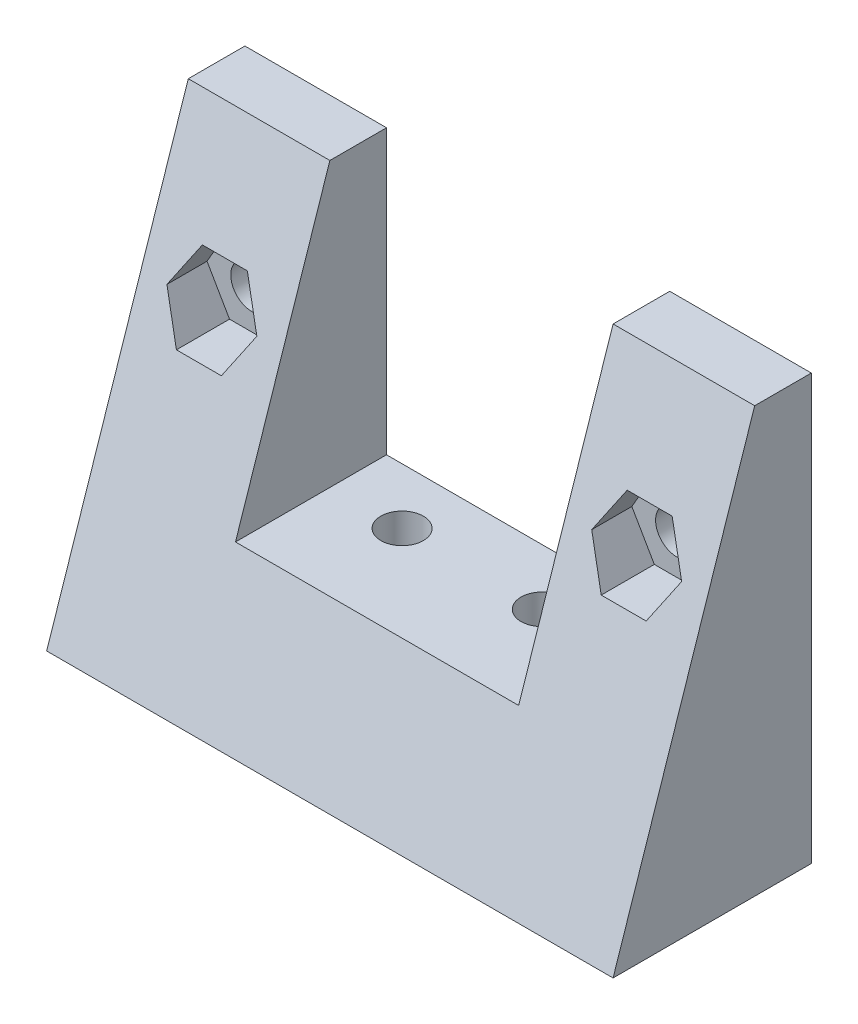
ISO-10303-21;
HEADER;
FILE_DESCRIPTION(('STEP AP214'),'2;1');
FILE_NAME('part.step','',(''),(''),'','','');
FILE_SCHEMA(('AUTOMOTIVE_DESIGN { 1 0 10303 214 1 1 1 1 }'));
ENDSEC;
DATA;
#1=APPLICATION_CONTEXT('core data for automotive mechanical design processes');
#2=APPLICATION_PROTOCOL_DEFINITION('international standard','automotive_design',2000,#1);
#3=PRODUCT_CONTEXT('',#1,'mechanical');
#4=PRODUCT('Part','Part','',(#3));
#5=PRODUCT_RELATED_PRODUCT_CATEGORY('part','',(#4));
#6=PRODUCT_DEFINITION_FORMATION('','',#4);
#7=PRODUCT_DEFINITION_CONTEXT('part definition',#1,'design');
#8=PRODUCT_DEFINITION('design','',#6,#7);
#9=PRODUCT_DEFINITION_SHAPE('','',#8);
#10=(LENGTH_UNIT() NAMED_UNIT(*) SI_UNIT(.MILLI.,.METRE.));
#11=(NAMED_UNIT(*) PLANE_ANGLE_UNIT() SI_UNIT($,.RADIAN.));
#12=(NAMED_UNIT(*) SI_UNIT($,.STERADIAN.) SOLID_ANGLE_UNIT());
#13=UNCERTAINTY_MEASURE_WITH_UNIT(LENGTH_MEASURE(1.E-05),#10,'distance_accuracy_value','');
#14=(GEOMETRIC_REPRESENTATION_CONTEXT(3) GLOBAL_UNCERTAINTY_ASSIGNED_CONTEXT((#13)) GLOBAL_UNIT_ASSIGNED_CONTEXT((#10,
#11,#12)) REPRESENTATION_CONTEXT('',''));
#15=CARTESIAN_POINT('',(0.,0.,0.));
#16=DIRECTION('',(0.,0.,1.));
#17=DIRECTION('',(1.,0.,0.));
#18=AXIS2_PLACEMENT_3D('',#15,#16,#17);
#19=CARTESIAN_POINT('',(-40.,0.,14.));
#20=DIRECTION('',(0.,0.316227766016838,0.948683298050514));
#21=DIRECTION('',(0.,-0.948683298050514,0.316227766016838));
#22=AXIS2_PLACEMENT_3D('',#19,#20,#21);
#23=PLANE('',#22);
#24=DIRECTION('',(-1.,0.,0.));
#25=VECTOR('',#24,1.);
#26=CARTESIAN_POINT('',(-40.,17.25,8.25));
#27=LINE('',#26,#25);
#28=CARTESIAN_POINT('',(-33.4122867597285,17.25,8.25));
#29=VERTEX_POINT('',#28);
#30=CARTESIAN_POINT('',(-36.5877132402715,17.25,8.25));
#31=VERTEX_POINT('',#30);
#32=EDGE_CURVE('E328',#29,#31,#27,.T.);
#33=ORIENTED_EDGE('',*,*,#32,.T.);
#34=DIRECTION('',(-0.480384461415261,0.832050294337844,-0.277350098112615));
#35=VECTOR('',#34,1.);
#36=CARTESIAN_POINT('',(-29.7141700744234,5.3446740087333,12.2184419970889));
#37=LINE('',#36,#35);
#38=CARTESIAN_POINT('',(-38.175426480543,20.,7.33333333333334));
#39=VERTEX_POINT('',#38);
#40=EDGE_CURVE('E346',#31,#39,#37,.T.);
#41=ORIENTED_EDGE('',*,*,#40,.T.);
#42=DIRECTION('',(0.48038446141526,0.832050294337844,-0.277350098112615));
#43=VECTOR('',#42,1.);
#44=CARTESIAN_POINT('',(-47.4787937417965,3.88609522203589,12.704634925988));
#45=LINE('',#44,#43);
#46=CARTESIAN_POINT('',(-36.5877132402715,22.75,6.41666666666667));
#47=VERTEX_POINT('',#46);
#48=EDGE_CURVE('E343',#39,#47,#45,.T.);
#49=ORIENTED_EDGE('',*,*,#48,.T.);
#50=DIRECTION('',(1.,0.,0.));
#51=VECTOR('',#50,1.);
#52=CARTESIAN_POINT('',(-40.,22.75,6.41666666666667));
#53=LINE('',#52,#51);
#54=CARTESIAN_POINT('',(-33.4122867597285,22.75,6.41666666666666));
#55=VERTEX_POINT('',#54);
#56=EDGE_CURVE('E340',#47,#55,#53,.T.);
#57=ORIENTED_EDGE('',*,*,#56,.T.);
#58=DIRECTION('',(0.480384461415262,-0.832050294337843,0.277350098112614));
#59=VECTOR('',#58,1.);
#60=CARTESIAN_POINT('',(-24.8288985658958,7.88313554719488,11.372288150935));
#61=LINE('',#60,#59);
#62=CARTESIAN_POINT('',(-31.8245735194571,20.,7.33333333333334));
#63=VERTEX_POINT('',#62);
#64=EDGE_CURVE('E337',#55,#63,#61,.T.);
#65=ORIENTED_EDGE('',*,*,#64,.T.);
#66=DIRECTION('',(-0.480384461415262,-0.832050294337843,0.277350098112614));
#67=VECTOR('',#66,1.);
#68=CARTESIAN_POINT('',(-42.5935222332689,1.34763368357437,13.5507887721419));
#69=LINE('',#68,#67);
#70=EDGE_CURVE('E334',#63,#29,#69,.T.);
#71=ORIENTED_EDGE('',*,*,#70,.T.);
#72=EDGE_LOOP('',(#33,#41,#49,#57,#65,#71));
#73=FACE_BOUND('',#72,.T.);
#74=DIRECTION('',(0.,0.948683298050514,-0.316227766016838));
#75=VECTOR('',#74,1.);
#76=CARTESIAN_POINT('',(-10.,0.,14.));
#77=LINE('',#76,#75);
#78=CARTESIAN_POINT('',(-10.,10.,10.6666666666667));
#79=VERTEX_POINT('',#78);
#80=CARTESIAN_POINT('',(-10.,30.,4.));
#81=VERTEX_POINT('',#80);
#82=EDGE_CURVE('E285',#79,#81,#77,.T.);
#83=ORIENTED_EDGE('',*,*,#82,.F.);
#84=DIRECTION('',(1.,0.,0.));
#85=VECTOR('',#84,1.);
#86=CARTESIAN_POINT('',(-40.,10.,10.6666666666667));
#87=LINE('',#86,#85);
#88=CARTESIAN_POINT('',(-30.,10.,10.6666666666667));
#89=VERTEX_POINT('',#88);
#90=EDGE_CURVE('E327',#89,#79,#87,.T.);
#91=ORIENTED_EDGE('',*,*,#90,.F.);
#92=DIRECTION('',(0.,-0.948683298050514,0.316227766016838));
#93=VECTOR('',#92,1.);
#94=CARTESIAN_POINT('',(-30.,0.,14.));
#95=LINE('',#94,#93);
#96=CARTESIAN_POINT('',(-30.,30.,4.));
#97=VERTEX_POINT('',#96);
#98=EDGE_CURVE('E282',#97,#89,#95,.T.);
#99=ORIENTED_EDGE('',*,*,#98,.F.);
#100=DIRECTION('',(1.,0.,0.));
#101=VECTOR('',#100,1.);
#102=CARTESIAN_POINT('',(-40.,30.,4.));
#103=LINE('',#102,#101);
#104=CARTESIAN_POINT('',(-40.,30.,4.));
#105=VERTEX_POINT('',#104);
#106=EDGE_CURVE('E317',#105,#97,#103,.T.);
#107=ORIENTED_EDGE('',*,*,#106,.F.);
#108=DIRECTION('',(0.,-0.948683298050514,0.316227766016838));
#109=VECTOR('',#108,1.);
#110=CARTESIAN_POINT('',(-40.,0.,14.));
#111=LINE('',#110,#109);
#112=CARTESIAN_POINT('',(-40.,0.,14.));
#113=VERTEX_POINT('',#112);
#114=EDGE_CURVE('E295',#105,#113,#111,.T.);
#115=ORIENTED_EDGE('',*,*,#114,.T.);
#116=DIRECTION('',(1.,0.,0.));
#117=VECTOR('',#116,1.);
#118=CARTESIAN_POINT('',(-40.,0.,14.));
#119=LINE('',#118,#117);
#120=CARTESIAN_POINT('',(0.,0.,14.));
#121=VERTEX_POINT('',#120);
#122=EDGE_CURVE('E315',#113,#121,#119,.T.);
#123=ORIENTED_EDGE('',*,*,#122,.T.);
#124=DIRECTION('',(0.,-0.948683298050514,0.316227766016838));
#125=VECTOR('',#124,1.);
#126=CARTESIAN_POINT('',(0.,0.,14.));
#127=LINE('',#126,#125);
#128=CARTESIAN_POINT('',(0.,30.,4.));
#129=VERTEX_POINT('',#128);
#130=EDGE_CURVE('E307',#129,#121,#127,.T.);
#131=ORIENTED_EDGE('',*,*,#130,.F.);
#132=EDGE_CURVE('E320',#81,#129,#103,.T.);
#133=ORIENTED_EDGE('',*,*,#132,.F.);
#134=EDGE_LOOP('',(#83,#91,#99,#107,#115,#123,#131,#133));
#135=FACE_BOUND('',#134,.T.);
#136=DIRECTION('',(-0.480384461415261,-0.832050294337844,0.277350098112615));
#137=VECTOR('',#136,1.);
#138=CARTESIAN_POINT('',(-19.5165991563458,-10.6434872919025,17.5478290973008));
#139=LINE('',#138,#137);
#140=CARTESIAN_POINT('',(-1.82457351945706,20.,7.33333333333333));
#141=VERTEX_POINT('',#140);
#142=CARTESIAN_POINT('',(-3.41228675972853,17.25,8.25));
#143=VERTEX_POINT('',#142);
#144=EDGE_CURVE('E176',#141,#143,#139,.T.);
#145=ORIENTED_EDGE('',*,*,#144,.T.);
#146=DIRECTION('',(-1.,0.,0.));
#147=VECTOR('',#146,1.);
#148=CARTESIAN_POINT('',(-40.,17.25,8.25));
#149=LINE('',#148,#147);
#150=CARTESIAN_POINT('',(-6.58771324027147,17.25,8.25));
#151=VERTEX_POINT('',#150);
#152=EDGE_CURVE('E12',#143,#151,#149,.T.);
#153=ORIENTED_EDGE('',*,*,#152,.T.);
#154=DIRECTION('',(-0.480384461415261,0.832050294337844,-0.277350098112615));
#155=VECTOR('',#154,1.);
#156=CARTESIAN_POINT('',(-6.63724699750033,17.3357949842102,8.22140167192995));
#157=LINE('',#156,#155);
#158=CARTESIAN_POINT('',(-8.17542648054295,20.,7.33333333333334));
#159=VERTEX_POINT('',#158);
#160=EDGE_CURVE('E44',#151,#159,#157,.T.);
#161=ORIENTED_EDGE('',*,*,#160,.T.);
#162=DIRECTION('',(0.480384461415261,0.832050294337844,-0.277350098112614));
#163=VECTOR('',#162,1.);
#164=CARTESIAN_POINT('',(-24.4018706648734,-8.10502575344093,16.701675251147));
#165=LINE('',#164,#163);
#166=CARTESIAN_POINT('',(-6.58771324027147,22.75,6.41666666666667));
#167=VERTEX_POINT('',#166);
#168=EDGE_CURVE('E355',#159,#167,#165,.T.);
#169=ORIENTED_EDGE('',*,*,#168,.T.);
#170=DIRECTION('',(1.,0.,0.));
#171=VECTOR('',#170,1.);
#172=CARTESIAN_POINT('',(-40.,22.75,6.41666666666667));
#173=LINE('',#172,#171);
#174=CARTESIAN_POINT('',(-3.41228675972852,22.75,6.41666666666667));
#175=VERTEX_POINT('',#174);
#176=EDGE_CURVE('E352',#167,#175,#173,.T.);
#177=ORIENTED_EDGE('',*,*,#176,.T.);
#178=DIRECTION('',(0.480384461415261,-0.832050294337844,0.277350098112615));
#179=VECTOR('',#178,1.);
#180=CARTESIAN_POINT('',(-1.75197548897271,19.8742565226717,7.37524782577611));
#181=LINE('',#180,#179);
#182=EDGE_CURVE('E350',#175,#141,#181,.T.);
#183=ORIENTED_EDGE('',*,*,#182,.T.);
#184=EDGE_LOOP('',(#145,#153,#161,#169,#177,#183));
#185=FACE_BOUND('',#184,.T.);
#186=ADVANCED_FACE('F36',(#73,#135,#185),#23,.T.);
#187=CARTESIAN_POINT('',(-40.,30.,4.));
#188=DIRECTION('',(0.,1.,0.));
#189=DIRECTION('',(0.,0.,1.));
#190=AXIS2_PLACEMENT_3D('',#187,#188,#189);
#191=PLANE('',#190);
#192=DIRECTION('',(0.,0.,-1.));
#193=VECTOR('',#192,1.);
#194=CARTESIAN_POINT('',(-10.,30.,4.));
#195=LINE('',#194,#193);
#196=CARTESIAN_POINT('',(-10.,30.,0.));
#197=VERTEX_POINT('',#196);
#198=EDGE_CURVE('E325',#81,#197,#195,.T.);
#199=ORIENTED_EDGE('',*,*,#198,.F.);
#200=ORIENTED_EDGE('',*,*,#132,.T.);
#201=DIRECTION('',(0.,0.,1.));
#202=VECTOR('',#201,1.);
#203=CARTESIAN_POINT('',(0.,30.,4.));
#204=LINE('',#203,#202);
#205=CARTESIAN_POINT('',(0.,30.,0.));
#206=VERTEX_POINT('',#205);
#207=EDGE_CURVE('E304',#206,#129,#204,.T.);
#208=ORIENTED_EDGE('',*,*,#207,.F.);
#209=DIRECTION('',(1.,0.,0.));
#210=VECTOR('',#209,1.);
#211=CARTESIAN_POINT('',(-40.,30.,0.));
#212=LINE('',#211,#210);
#213=EDGE_CURVE('E301',#197,#206,#212,.T.);
#214=ORIENTED_EDGE('',*,*,#213,.F.);
#215=EDGE_LOOP('',(#199,#200,#208,#214));
#216=FACE_BOUND('',#215,.T.);
#217=ADVANCED_FACE('F379',(#216),#191,.T.);
#218=CARTESIAN_POINT('',(-40.,30.,0.));
#219=DIRECTION('',(0.,0.,-1.));
#220=DIRECTION('',(0.,1.,0.));
#221=AXIS2_PLACEMENT_3D('',#218,#219,#220);
#222=PLANE('',#221);
#223=CARTESIAN_POINT('',(-5.,20.,0.));
#224=DIRECTION('',(0.,0.,-1.));
#225=DIRECTION('',(0.,1.,0.));
#226=AXIS2_PLACEMENT_3D('',#223,#224,#225);
#227=CIRCLE('',#226,1.5);
#228=CARTESIAN_POINT('',(-5.,21.5,0.));
#229=VERTEX_POINT('',#228);
#230=EDGE_CURVE('E266',#229,#229,#227,.T.);
#231=ORIENTED_EDGE('',*,*,#230,.F.);
#232=EDGE_LOOP('',(#231));
#233=FACE_BOUND('',#232,.T.);
#234=CARTESIAN_POINT('',(-35.,20.,0.));
#235=DIRECTION('',(0.,0.,-1.));
#236=DIRECTION('',(0.,-1.,0.));
#237=AXIS2_PLACEMENT_3D('',#234,#235,#236);
#238=CIRCLE('',#237,1.5);
#239=CARTESIAN_POINT('',(-35.,18.5,0.));
#240=VERTEX_POINT('',#239);
#241=EDGE_CURVE('E256',#240,#240,#238,.T.);
#242=ORIENTED_EDGE('',*,*,#241,.F.);
#243=EDGE_LOOP('',(#242));
#244=FACE_BOUND('',#243,.T.);
#245=DIRECTION('',(0.,-1.,0.));
#246=VECTOR('',#245,1.);
#247=CARTESIAN_POINT('',(-10.,30.,0.));
#248=LINE('',#247,#246);
#249=CARTESIAN_POINT('',(-10.,10.,0.));
#250=VERTEX_POINT('',#249);
#251=EDGE_CURVE('E269',#197,#250,#248,.T.);
#252=ORIENTED_EDGE('',*,*,#251,.F.);
#253=ORIENTED_EDGE('',*,*,#213,.T.);
#254=DIRECTION('',(0.,1.,0.));
#255=VECTOR('',#254,1.);
#256=CARTESIAN_POINT('',(0.,30.,0.));
#257=LINE('',#256,#255);
#258=CARTESIAN_POINT('',(0.,0.,0.));
#259=VERTEX_POINT('',#258);
#260=EDGE_CURVE('E287',#259,#206,#257,.T.);
#261=ORIENTED_EDGE('',*,*,#260,.F.);
#262=DIRECTION('',(1.,0.,0.));
#263=VECTOR('',#262,1.);
#264=CARTESIAN_POINT('',(-40.,0.,0.));
#265=LINE('',#264,#263);
#266=CARTESIAN_POINT('',(-40.,0.,0.));
#267=VERTEX_POINT('',#266);
#268=EDGE_CURVE('E312',#267,#259,#265,.T.);
#269=ORIENTED_EDGE('',*,*,#268,.F.);
#270=DIRECTION('',(0.,1.,0.));
#271=VECTOR('',#270,1.);
#272=CARTESIAN_POINT('',(-40.,30.,0.));
#273=LINE('',#272,#271);
#274=CARTESIAN_POINT('',(-40.,30.,0.));
#275=VERTEX_POINT('',#274);
#276=EDGE_CURVE('E288',#267,#275,#273,.T.);
#277=ORIENTED_EDGE('',*,*,#276,.T.);
#278=CARTESIAN_POINT('',(-30.,30.,0.));
#279=VERTEX_POINT('',#278);
#280=EDGE_CURVE('E321',#275,#279,#212,.T.);
#281=ORIENTED_EDGE('',*,*,#280,.T.);
#282=DIRECTION('',(0.,1.,0.));
#283=VECTOR('',#282,1.);
#284=CARTESIAN_POINT('',(-30.,30.,0.));
#285=LINE('',#284,#283);
#286=CARTESIAN_POINT('',(-30.,10.,0.));
#287=VERTEX_POINT('',#286);
#288=EDGE_CURVE('E277',#287,#279,#285,.T.);
#289=ORIENTED_EDGE('',*,*,#288,.F.);
#290=DIRECTION('',(-1.,0.,0.));
#291=VECTOR('',#290,1.);
#292=CARTESIAN_POINT('',(-10.,10.,0.));
#293=LINE('',#292,#291);
#294=EDGE_CURVE('E274',#250,#287,#293,.T.);
#295=ORIENTED_EDGE('',*,*,#294,.F.);
#296=EDGE_LOOP('',(#252,#253,#261,#269,#277,#281,#289,#295));
#297=FACE_BOUND('',#296,.T.);
#298=ADVANCED_FACE('F38',(#233,#244,#297),#222,.T.);
#299=CARTESIAN_POINT('',(-40.,0.,0.));
#300=DIRECTION('',(0.,-1.,0.));
#301=DIRECTION('',(0.,0.,-1.));
#302=AXIS2_PLACEMENT_3D('',#299,#300,#301);
#303=PLANE('',#302);
#304=CARTESIAN_POINT('',(-24.95,0.,3.95));
#305=DIRECTION('',(0.,1.,0.));
#306=DIRECTION('',(0.,0.,1.));
#307=AXIS2_PLACEMENT_3D('',#304,#305,#306);
#308=CIRCLE('',#307,1.5);
#309=CARTESIAN_POINT('',(-24.95,0.,5.45));
#310=VERTEX_POINT('',#309);
#311=EDGE_CURVE('E253',#310,#310,#308,.T.);
#312=ORIENTED_EDGE('',*,*,#311,.T.);
#313=EDGE_LOOP('',(#312));
#314=FACE_BOUND('',#313,.T.);
#315=CARTESIAN_POINT('',(-15.05,0.,3.95));
#316=DIRECTION('',(0.,1.,0.));
#317=DIRECTION('',(0.,0.,-1.));
#318=AXIS2_PLACEMENT_3D('',#315,#316,#317);
#319=CIRCLE('',#318,1.5);
#320=CARTESIAN_POINT('',(-15.05,0.,2.45));
#321=VERTEX_POINT('',#320);
#322=EDGE_CURVE('E260',#321,#321,#319,.T.);
#323=ORIENTED_EDGE('',*,*,#322,.T.);
#324=EDGE_LOOP('',(#323));
#325=FACE_BOUND('',#324,.T.);
#326=DIRECTION('',(0.,0.,-1.));
#327=VECTOR('',#326,1.);
#328=CARTESIAN_POINT('',(0.,0.,0.));
#329=LINE('',#328,#327);
#330=EDGE_CURVE('E292',#121,#259,#329,.T.);
#331=ORIENTED_EDGE('',*,*,#330,.F.);
#332=ORIENTED_EDGE('',*,*,#122,.F.);
#333=DIRECTION('',(0.,0.,-1.));
#334=VECTOR('',#333,1.);
#335=CARTESIAN_POINT('',(-40.,0.,0.));
#336=LINE('',#335,#334);
#337=EDGE_CURVE('E298',#113,#267,#336,.T.);
#338=ORIENTED_EDGE('',*,*,#337,.T.);
#339=ORIENTED_EDGE('',*,*,#268,.T.);
#340=EDGE_LOOP('',(#331,#332,#338,#339));
#341=FACE_BOUND('',#340,.T.);
#342=ADVANCED_FACE('F389',(#314,#325,#341),#303,.T.);
#343=DIRECTION('',(0.,0.,1.));
#344=VECTOR('',#343,1.);
#345=CARTESIAN_POINT('',(-30.,30.,4.));
#346=LINE('',#345,#344);
#347=EDGE_CURVE('E314',#279,#97,#346,.T.);
#348=ORIENTED_EDGE('',*,*,#347,.F.);
#349=ORIENTED_EDGE('',*,*,#280,.F.);
#350=DIRECTION('',(0.,0.,1.));
#351=VECTOR('',#350,1.);
#352=CARTESIAN_POINT('',(-40.,30.,4.));
#353=LINE('',#352,#351);
#354=EDGE_CURVE('E291',#275,#105,#353,.T.);
#355=ORIENTED_EDGE('',*,*,#354,.T.);
#356=ORIENTED_EDGE('',*,*,#106,.T.);
#357=EDGE_LOOP('',(#348,#349,#355,#356));
#358=FACE_BOUND('',#357,.T.);
#359=ADVANCED_FACE('F386',(#358),#191,.T.);
#360=CARTESIAN_POINT('',(-40.,0.,0.));
#361=DIRECTION('',(-1.,0.,0.));
#362=DIRECTION('',(0.,0.,1.));
#363=AXIS2_PLACEMENT_3D('',#360,#361,#362);
#364=PLANE('',#363);
#365=ORIENTED_EDGE('',*,*,#276,.F.);
#366=ORIENTED_EDGE('',*,*,#337,.F.);
#367=ORIENTED_EDGE('',*,*,#114,.F.);
#368=ORIENTED_EDGE('',*,*,#354,.F.);
#369=EDGE_LOOP('',(#365,#366,#367,#368));
#370=FACE_BOUND('',#369,.T.);
#371=ADVANCED_FACE('F392',(#370),#364,.T.);
#372=CARTESIAN_POINT('',(0.,0.,0.));
#373=DIRECTION('',(-1.,0.,0.));
#374=DIRECTION('',(0.,0.,1.));
#375=AXIS2_PLACEMENT_3D('',#372,#373,#374);
#376=PLANE('',#375);
#377=ORIENTED_EDGE('',*,*,#260,.T.);
#378=ORIENTED_EDGE('',*,*,#207,.T.);
#379=ORIENTED_EDGE('',*,*,#130,.T.);
#380=ORIENTED_EDGE('',*,*,#330,.T.);
#381=EDGE_LOOP('',(#377,#378,#379,#380));
#382=FACE_BOUND('',#381,.T.);
#383=ADVANCED_FACE('F398',(#382),#376,.F.);
#384=CARTESIAN_POINT('',(-10.,30.,14.));
#385=DIRECTION('',(1.,0.,0.));
#386=DIRECTION('',(0.,1.,0.));
#387=AXIS2_PLACEMENT_3D('',#384,#385,#386);
#388=PLANE('',#387);
#389=ORIENTED_EDGE('',*,*,#82,.T.);
#390=ORIENTED_EDGE('',*,*,#198,.T.);
#391=ORIENTED_EDGE('',*,*,#251,.T.);
#392=DIRECTION('',(0.,0.,-1.));
#393=VECTOR('',#392,1.);
#394=CARTESIAN_POINT('',(-10.,10.,14.));
#395=LINE('',#394,#393);
#396=EDGE_CURVE('E279',#79,#250,#395,.T.);
#397=ORIENTED_EDGE('',*,*,#396,.F.);
#398=EDGE_LOOP('',(#389,#390,#391,#397));
#399=FACE_BOUND('',#398,.T.);
#400=ADVANCED_FACE('F430',(#399),#388,.F.);
#401=CARTESIAN_POINT('',(-30.,30.,14.));
#402=DIRECTION('',(-1.,0.,0.));
#403=DIRECTION('',(0.,-1.,0.));
#404=AXIS2_PLACEMENT_3D('',#401,#402,#403);
#405=PLANE('',#404);
#406=ORIENTED_EDGE('',*,*,#98,.T.);
#407=DIRECTION('',(0.,0.,-1.));
#408=VECTOR('',#407,1.);
#409=CARTESIAN_POINT('',(-30.,10.,14.));
#410=LINE('',#409,#408);
#411=EDGE_CURVE('E280',#89,#287,#410,.T.);
#412=ORIENTED_EDGE('',*,*,#411,.T.);
#413=ORIENTED_EDGE('',*,*,#288,.T.);
#414=ORIENTED_EDGE('',*,*,#347,.T.);
#415=EDGE_LOOP('',(#406,#412,#413,#414));
#416=FACE_BOUND('',#415,.T.);
#417=ADVANCED_FACE('F420',(#416),#405,.F.);
#418=CARTESIAN_POINT('',(-10.,10.,14.));
#419=DIRECTION('',(0.,-1.,0.));
#420=DIRECTION('',(0.,0.,-1.));
#421=AXIS2_PLACEMENT_3D('',#418,#419,#420);
#422=PLANE('',#421);
#423=CARTESIAN_POINT('',(-24.95,10.,3.95));
#424=DIRECTION('',(0.,1.,0.));
#425=DIRECTION('',(0.,0.,1.));
#426=AXIS2_PLACEMENT_3D('',#423,#424,#425);
#427=CIRCLE('',#426,1.5);
#428=CARTESIAN_POINT('',(-24.95,10.,5.45));
#429=VERTEX_POINT('',#428);
#430=EDGE_CURVE('E257',#429,#429,#427,.T.);
#431=ORIENTED_EDGE('',*,*,#430,.F.);
#432=EDGE_LOOP('',(#431));
#433=FACE_BOUND('',#432,.T.);
#434=CARTESIAN_POINT('',(-15.05,10.,3.95));
#435=DIRECTION('',(0.,1.,0.));
#436=DIRECTION('',(0.,0.,-1.));
#437=AXIS2_PLACEMENT_3D('',#434,#435,#436);
#438=CIRCLE('',#437,1.5);
#439=CARTESIAN_POINT('',(-15.05,10.,2.45));
#440=VERTEX_POINT('',#439);
#441=EDGE_CURVE('E263',#440,#440,#438,.T.);
#442=ORIENTED_EDGE('',*,*,#441,.F.);
#443=EDGE_LOOP('',(#442));
#444=FACE_BOUND('',#443,.T.);
#445=ORIENTED_EDGE('',*,*,#90,.T.);
#446=ORIENTED_EDGE('',*,*,#396,.T.);
#447=ORIENTED_EDGE('',*,*,#294,.T.);
#448=ORIENTED_EDGE('',*,*,#411,.F.);
#449=EDGE_LOOP('',(#445,#446,#447,#448));
#450=FACE_BOUND('',#449,.T.);
#451=ADVANCED_FACE('F422',(#433,#444,#450),#422,.F.);
#452=CARTESIAN_POINT('',(-35.,20.,14.));
#453=DIRECTION('',(0.,0.,-1.));
#454=DIRECTION('',(0.,1.,0.));
#455=AXIS2_PLACEMENT_3D('',#452,#453,#454);
#456=CYLINDRICAL_SURFACE('',#455,1.5);
#457=CARTESIAN_POINT('',(-35.,20.,4.5));
#458=DIRECTION('',(0.,0.,-1.));
#459=DIRECTION('',(0.,1.,0.));
#460=AXIS2_PLACEMENT_3D('',#457,#458,#459);
#461=CIRCLE('',#460,1.5);
#462=CARTESIAN_POINT('',(-35.,21.5,4.5));
#463=VERTEX_POINT('',#462);
#464=EDGE_CURVE('E198',#463,#463,#461,.F.);
#465=ORIENTED_EDGE('',*,*,#464,.T.);
#466=EDGE_LOOP('',(#465));
#467=FACE_BOUND('',#466,.T.);
#468=ORIENTED_EDGE('',*,*,#241,.T.);
#469=EDGE_LOOP('',(#468));
#470=FACE_BOUND('',#469,.T.);
#471=ADVANCED_FACE('F440',(#467,#470),#456,.F.);
#472=CARTESIAN_POINT('',(-5.,20.,14.));
#473=DIRECTION('',(0.,0.,-1.));
#474=DIRECTION('',(0.,1.,0.));
#475=AXIS2_PLACEMENT_3D('',#472,#473,#474);
#476=CYLINDRICAL_SURFACE('',#475,1.5);
#477=CARTESIAN_POINT('',(-5.,20.,4.5));
#478=DIRECTION('',(0.,0.,-1.));
#479=DIRECTION('',(0.,1.,0.));
#480=AXIS2_PLACEMENT_3D('',#477,#478,#479);
#481=CIRCLE('',#480,1.5);
#482=CARTESIAN_POINT('',(-5.,21.5,4.5));
#483=VERTEX_POINT('',#482);
#484=EDGE_CURVE('E194',#483,#483,#481,.F.);
#485=ORIENTED_EDGE('',*,*,#484,.T.);
#486=EDGE_LOOP('',(#485));
#487=FACE_BOUND('',#486,.T.);
#488=ORIENTED_EDGE('',*,*,#230,.T.);
#489=EDGE_LOOP('',(#488));
#490=FACE_BOUND('',#489,.T.);
#491=ADVANCED_FACE('F445',(#487,#490),#476,.F.);
#492=CARTESIAN_POINT('',(-15.05,0.,3.95));
#493=DIRECTION('',(0.,1.,0.));
#494=DIRECTION('',(0.,0.,1.));
#495=AXIS2_PLACEMENT_3D('',#492,#493,#494);
#496=CYLINDRICAL_SURFACE('',#495,1.5);
#497=ORIENTED_EDGE('',*,*,#322,.F.);
#498=EDGE_LOOP('',(#497));
#499=FACE_BOUND('',#498,.T.);
#500=ORIENTED_EDGE('',*,*,#441,.T.);
#501=EDGE_LOOP('',(#500));
#502=FACE_BOUND('',#501,.T.);
#503=ADVANCED_FACE('F449',(#499,#502),#496,.F.);
#504=CARTESIAN_POINT('',(-24.95,0.,3.95));
#505=DIRECTION('',(0.,1.,0.));
#506=DIRECTION('',(0.,0.,1.));
#507=AXIS2_PLACEMENT_3D('',#504,#505,#506);
#508=CYLINDRICAL_SURFACE('',#507,1.5);
#509=ORIENTED_EDGE('',*,*,#311,.F.);
#510=EDGE_LOOP('',(#509));
#511=FACE_BOUND('',#510,.T.);
#512=ORIENTED_EDGE('',*,*,#430,.T.);
#513=EDGE_LOOP('',(#512));
#514=FACE_BOUND('',#513,.T.);
#515=ADVANCED_FACE('F453',(#511,#514),#508,.F.);
#516=CARTESIAN_POINT('',(-40.,30.,4.5));
#517=DIRECTION('',(0.,0.,-1.));
#518=DIRECTION('',(0.,1.,0.));
#519=AXIS2_PLACEMENT_3D('',#516,#517,#518);
#520=PLANE('',#519);
#521=DIRECTION('',(-0.5,-0.866025403784439,0.));
#522=VECTOR('',#521,1.);
#523=CARTESIAN_POINT('',(-1.82457351945706,20.,4.5));
#524=LINE('',#523,#522);
#525=CARTESIAN_POINT('',(-1.82457351945706,20.,4.5));
#526=VERTEX_POINT('',#525);
#527=CARTESIAN_POINT('',(-3.41228675972853,17.25,4.5));
#528=VERTEX_POINT('',#527);
#529=EDGE_CURVE('E174',#526,#528,#524,.T.);
#530=ORIENTED_EDGE('',*,*,#529,.F.);
#531=DIRECTION('',(0.5,-0.866025403784439,0.));
#532=VECTOR('',#531,1.);
#533=CARTESIAN_POINT('',(-3.41228675972853,22.75,4.5));
#534=LINE('',#533,#532);
#535=CARTESIAN_POINT('',(-3.41228675972853,22.75,4.5));
#536=VERTEX_POINT('',#535);
#537=EDGE_CURVE('E186',#536,#526,#534,.T.);
#538=ORIENTED_EDGE('',*,*,#537,.F.);
#539=DIRECTION('',(1.,0.,0.));
#540=VECTOR('',#539,1.);
#541=CARTESIAN_POINT('',(-6.58771324027147,22.75,4.5));
#542=LINE('',#541,#540);
#543=CARTESIAN_POINT('',(-6.58771324027147,22.75,4.5));
#544=VERTEX_POINT('',#543);
#545=EDGE_CURVE('E195',#544,#536,#542,.T.);
#546=ORIENTED_EDGE('',*,*,#545,.F.);
#547=DIRECTION('',(0.5,0.866025403784439,0.));
#548=VECTOR('',#547,1.);
#549=CARTESIAN_POINT('',(-8.17542648054294,20.,4.5));
#550=LINE('',#549,#548);
#551=CARTESIAN_POINT('',(-8.17542648054294,20.,4.5));
#552=VERTEX_POINT('',#551);
#553=EDGE_CURVE('E200',#552,#544,#550,.T.);
#554=ORIENTED_EDGE('',*,*,#553,.F.);
#555=DIRECTION('',(-0.5,0.866025403784439,0.));
#556=VECTOR('',#555,1.);
#557=CARTESIAN_POINT('',(-6.58771324027147,17.25,4.5));
#558=LINE('',#557,#556);
#559=CARTESIAN_POINT('',(-6.58771324027147,17.25,4.5));
#560=VERTEX_POINT('',#559);
#561=EDGE_CURVE('E205',#560,#552,#558,.T.);
#562=ORIENTED_EDGE('',*,*,#561,.F.);
#563=DIRECTION('',(-1.,0.,0.));
#564=VECTOR('',#563,1.);
#565=CARTESIAN_POINT('',(-3.41228675972853,17.25,4.5));
#566=LINE('',#565,#564);
#567=EDGE_CURVE('E189',#528,#560,#566,.T.);
#568=ORIENTED_EDGE('',*,*,#567,.F.);
#569=EDGE_LOOP('',(#530,#538,#546,#554,#562,#568));
#570=FACE_BOUND('',#569,.T.);
#571=ORIENTED_EDGE('',*,*,#484,.F.);
#572=EDGE_LOOP('',(#571));
#573=FACE_BOUND('',#572,.T.);
#574=ADVANCED_FACE('F184',(#570,#573),#520,.F.);
#575=CARTESIAN_POINT('',(-3.41228675972853,17.25,-8.40138877408571));
#576=DIRECTION('',(0.,1.,0.));
#577=DIRECTION('',(0.,0.,1.));
#578=AXIS2_PLACEMENT_3D('',#575,#576,#577);
#579=PLANE('',#578);
#580=DIRECTION('',(0.,0.,1.));
#581=VECTOR('',#580,1.);
#582=CARTESIAN_POINT('',(-3.41228675972853,17.25,-8.40138877408571));
#583=LINE('',#582,#581);
#584=EDGE_CURVE('E51',#528,#143,#583,.T.);
#585=ORIENTED_EDGE('',*,*,#584,.F.);
#586=ORIENTED_EDGE('',*,*,#567,.T.);
#587=DIRECTION('',(0.,0.,1.));
#588=VECTOR('',#587,1.);
#589=CARTESIAN_POINT('',(-6.58771324027147,17.25,-8.40138877408571));
#590=LINE('',#589,#588);
#591=EDGE_CURVE('E209',#560,#151,#590,.T.);
#592=ORIENTED_EDGE('',*,*,#591,.T.);
#593=ORIENTED_EDGE('',*,*,#152,.F.);
#594=EDGE_LOOP('',(#585,#586,#592,#593));
#595=FACE_BOUND('',#594,.T.);
#596=ADVANCED_FACE('F364',(#595),#579,.T.);
#597=CARTESIAN_POINT('',(-6.58771324027147,17.25,-8.40138877408571));
#598=DIRECTION('',(0.866025403784439,0.5,0.));
#599=DIRECTION('',(-0.5,0.866025403784439,0.));
#600=AXIS2_PLACEMENT_3D('',#597,#598,#599);
#601=PLANE('',#600);
#602=ORIENTED_EDGE('',*,*,#591,.F.);
#603=ORIENTED_EDGE('',*,*,#561,.T.);
#604=DIRECTION('',(0.,0.,1.));
#605=VECTOR('',#604,1.);
#606=CARTESIAN_POINT('',(-8.17542648054294,20.,-8.40138877408571));
#607=LINE('',#606,#605);
#608=EDGE_CURVE('E212',#552,#159,#607,.T.);
#609=ORIENTED_EDGE('',*,*,#608,.T.);
#610=ORIENTED_EDGE('',*,*,#160,.F.);
#611=EDGE_LOOP('',(#602,#603,#609,#610));
#612=FACE_BOUND('',#611,.T.);
#613=ADVANCED_FACE('F361',(#612),#601,.T.);
#614=CARTESIAN_POINT('',(-8.17542648054294,20.,-8.40138877408571));
#615=DIRECTION('',(0.866025403784439,-0.5,0.));
#616=DIRECTION('',(0.5,0.866025403784439,0.));
#617=AXIS2_PLACEMENT_3D('',#614,#615,#616);
#618=PLANE('',#617);
#619=ORIENTED_EDGE('',*,*,#608,.F.);
#620=ORIENTED_EDGE('',*,*,#553,.T.);
#621=DIRECTION('',(0.,0.,1.));
#622=VECTOR('',#621,1.);
#623=CARTESIAN_POINT('',(-6.58771324027147,22.75,-8.40138877408571));
#624=LINE('',#623,#622);
#625=EDGE_CURVE('E215',#544,#167,#624,.T.);
#626=ORIENTED_EDGE('',*,*,#625,.T.);
#627=ORIENTED_EDGE('',*,*,#168,.F.);
#628=EDGE_LOOP('',(#619,#620,#626,#627));
#629=FACE_BOUND('',#628,.T.);
#630=ADVANCED_FACE('F369',(#629),#618,.T.);
#631=CARTESIAN_POINT('',(-6.58771324027147,22.75,-8.40138877408571));
#632=DIRECTION('',(0.,-1.,0.));
#633=DIRECTION('',(0.,0.,-1.));
#634=AXIS2_PLACEMENT_3D('',#631,#632,#633);
#635=PLANE('',#634);
#636=ORIENTED_EDGE('',*,*,#625,.F.);
#637=ORIENTED_EDGE('',*,*,#545,.T.);
#638=DIRECTION('',(0.,0.,1.));
#639=VECTOR('',#638,1.);
#640=CARTESIAN_POINT('',(-3.41228675972853,22.75,-8.40138877408571));
#641=LINE('',#640,#639);
#642=EDGE_CURVE('E180',#536,#175,#641,.T.);
#643=ORIENTED_EDGE('',*,*,#642,.T.);
#644=ORIENTED_EDGE('',*,*,#176,.F.);
#645=EDGE_LOOP('',(#636,#637,#643,#644));
#646=FACE_BOUND('',#645,.T.);
#647=ADVANCED_FACE('F367',(#646),#635,.T.);
#648=CARTESIAN_POINT('',(-3.41228675972853,22.75,-8.40138877408571));
#649=DIRECTION('',(-0.866025403784439,-0.5,0.));
#650=DIRECTION('',(0.5,-0.866025403784439,0.));
#651=AXIS2_PLACEMENT_3D('',#648,#649,#650);
#652=PLANE('',#651);
#653=ORIENTED_EDGE('',*,*,#642,.F.);
#654=ORIENTED_EDGE('',*,*,#537,.T.);
#655=DIRECTION('',(0.,0.,1.));
#656=VECTOR('',#655,1.);
#657=CARTESIAN_POINT('',(-1.82457351945706,20.,-8.40138877408571));
#658=LINE('',#657,#656);
#659=EDGE_CURVE('E171',#526,#141,#658,.T.);
#660=ORIENTED_EDGE('',*,*,#659,.T.);
#661=ORIENTED_EDGE('',*,*,#182,.F.);
#662=EDGE_LOOP('',(#653,#654,#660,#661));
#663=FACE_BOUND('',#662,.T.);
#664=ADVANCED_FACE('F191',(#663),#652,.T.);
#665=CARTESIAN_POINT('',(-1.82457351945706,20.,-8.40138877408571));
#666=DIRECTION('',(-0.866025403784439,0.5,0.));
#667=DIRECTION('',(-0.5,-0.866025403784439,0.));
#668=AXIS2_PLACEMENT_3D('',#665,#666,#667);
#669=PLANE('',#668);
#670=ORIENTED_EDGE('',*,*,#659,.F.);
#671=ORIENTED_EDGE('',*,*,#529,.T.);
#672=ORIENTED_EDGE('',*,*,#584,.T.);
#673=ORIENTED_EDGE('',*,*,#144,.F.);
#674=EDGE_LOOP('',(#670,#671,#672,#673));
#675=FACE_BOUND('',#674,.T.);
#676=ADVANCED_FACE('F173',(#675),#669,.T.);
#677=CARTESIAN_POINT('',(-40.,30.,4.5));
#678=DIRECTION('',(0.,0.,-1.));
#679=DIRECTION('',(0.,1.,0.));
#680=AXIS2_PLACEMENT_3D('',#677,#678,#679);
#681=PLANE('',#680);
#682=DIRECTION('',(-1.,0.,0.));
#683=VECTOR('',#682,1.);
#684=CARTESIAN_POINT('',(-36.5877132402715,17.25,4.5));
#685=LINE('',#684,#683);
#686=CARTESIAN_POINT('',(-33.4122867597285,17.25,4.5));
#687=VERTEX_POINT('',#686);
#688=CARTESIAN_POINT('',(-36.5877132402715,17.25,4.5));
#689=VERTEX_POINT('',#688);
#690=EDGE_CURVE('E235',#687,#689,#685,.T.);
#691=ORIENTED_EDGE('',*,*,#690,.F.);
#692=DIRECTION('',(-0.5,-0.866025403784438,0.));
#693=VECTOR('',#692,1.);
#694=CARTESIAN_POINT('',(-33.4122867597285,17.25,4.5));
#695=LINE('',#694,#693);
#696=CARTESIAN_POINT('',(-31.8245735194571,20.,4.5));
#697=VERTEX_POINT('',#696);
#698=EDGE_CURVE('E220',#697,#687,#695,.T.);
#699=ORIENTED_EDGE('',*,*,#698,.F.);
#700=DIRECTION('',(0.500000000000001,-0.866025403784438,0.));
#701=VECTOR('',#700,1.);
#702=CARTESIAN_POINT('',(-31.8245735194571,20.,4.5));
#703=LINE('',#702,#701);
#704=CARTESIAN_POINT('',(-33.4122867597285,22.75,4.5));
#705=VERTEX_POINT('',#704);
#706=EDGE_CURVE('E223',#705,#697,#703,.T.);
#707=ORIENTED_EDGE('',*,*,#706,.F.);
#708=DIRECTION('',(1.,0.,0.));
#709=VECTOR('',#708,1.);
#710=CARTESIAN_POINT('',(-33.4122867597285,22.75,4.5));
#711=LINE('',#710,#709);
#712=CARTESIAN_POINT('',(-36.5877132402715,22.75,4.5));
#713=VERTEX_POINT('',#712);
#714=EDGE_CURVE('E226',#713,#705,#711,.T.);
#715=ORIENTED_EDGE('',*,*,#714,.F.);
#716=DIRECTION('',(0.499999999999999,0.866025403784439,0.));
#717=VECTOR('',#716,1.);
#718=CARTESIAN_POINT('',(-36.5877132402715,22.75,4.5));
#719=LINE('',#718,#717);
#720=CARTESIAN_POINT('',(-38.1754264805429,20.,4.5));
#721=VERTEX_POINT('',#720);
#722=EDGE_CURVE('E229',#721,#713,#719,.T.);
#723=ORIENTED_EDGE('',*,*,#722,.F.);
#724=DIRECTION('',(-0.499999999999999,0.866025403784439,0.));
#725=VECTOR('',#724,1.);
#726=CARTESIAN_POINT('',(-38.1754264805429,20.,4.5));
#727=LINE('',#726,#725);
#728=EDGE_CURVE('E232',#689,#721,#727,.T.);
#729=ORIENTED_EDGE('',*,*,#728,.F.);
#730=EDGE_LOOP('',(#691,#699,#707,#715,#723,#729));
#731=FACE_BOUND('',#730,.T.);
#732=ORIENTED_EDGE('',*,*,#464,.F.);
#733=EDGE_LOOP('',(#732));
#734=FACE_BOUND('',#733,.T.);
#735=ADVANCED_FACE('F458',(#731,#734),#681,.F.);
#736=CARTESIAN_POINT('',(-38.1754264805429,20.,-8.40138877408571));
#737=DIRECTION('',(0.866025403784439,0.499999999999999,0.));
#738=DIRECTION('',(-0.499999999999999,0.866025403784439,0.));
#739=AXIS2_PLACEMENT_3D('',#736,#737,#738);
#740=PLANE('',#739);
#741=DIRECTION('',(0.,0.,1.));
#742=VECTOR('',#741,1.);
#743=CARTESIAN_POINT('',(-36.5877132402715,17.25,-8.40138877408571));
#744=LINE('',#743,#742);
#745=EDGE_CURVE('E59',#689,#31,#744,.T.);
#746=ORIENTED_EDGE('',*,*,#745,.F.);
#747=ORIENTED_EDGE('',*,*,#728,.T.);
#748=DIRECTION('',(0.,0.,1.));
#749=VECTOR('',#748,1.);
#750=CARTESIAN_POINT('',(-38.1754264805429,20.,-8.40138877408571));
#751=LINE('',#750,#749);
#752=EDGE_CURVE('E238',#721,#39,#751,.T.);
#753=ORIENTED_EDGE('',*,*,#752,.T.);
#754=ORIENTED_EDGE('',*,*,#40,.F.);
#755=EDGE_LOOP('',(#746,#747,#753,#754));
#756=FACE_BOUND('',#755,.T.);
#757=ADVANCED_FACE('F461',(#756),#740,.T.);
#758=CARTESIAN_POINT('',(-36.5877132402715,22.75,-8.40138877408571));
#759=DIRECTION('',(0.866025403784439,-0.499999999999999,0.));
#760=DIRECTION('',(0.499999999999999,0.866025403784439,0.));
#761=AXIS2_PLACEMENT_3D('',#758,#759,#760);
#762=PLANE('',#761);
#763=ORIENTED_EDGE('',*,*,#752,.F.);
#764=ORIENTED_EDGE('',*,*,#722,.T.);
#765=DIRECTION('',(0.,0.,1.));
#766=VECTOR('',#765,1.);
#767=CARTESIAN_POINT('',(-36.5877132402715,22.75,-8.40138877408571));
#768=LINE('',#767,#766);
#769=EDGE_CURVE('E241',#713,#47,#768,.T.);
#770=ORIENTED_EDGE('',*,*,#769,.T.);
#771=ORIENTED_EDGE('',*,*,#48,.F.);
#772=EDGE_LOOP('',(#763,#764,#770,#771));
#773=FACE_BOUND('',#772,.T.);
#774=ADVANCED_FACE('F465',(#773),#762,.T.);
#775=CARTESIAN_POINT('',(-33.4122867597285,22.75,-8.40138877408571));
#776=DIRECTION('',(0.,-1.,0.));
#777=DIRECTION('',(0.,0.,-1.));
#778=AXIS2_PLACEMENT_3D('',#775,#776,#777);
#779=PLANE('',#778);
#780=ORIENTED_EDGE('',*,*,#769,.F.);
#781=ORIENTED_EDGE('',*,*,#714,.T.);
#782=DIRECTION('',(0.,0.,1.));
#783=VECTOR('',#782,1.);
#784=CARTESIAN_POINT('',(-33.4122867597285,22.75,-8.40138877408571));
#785=LINE('',#784,#783);
#786=EDGE_CURVE('E244',#705,#55,#785,.T.);
#787=ORIENTED_EDGE('',*,*,#786,.T.);
#788=ORIENTED_EDGE('',*,*,#56,.F.);
#789=EDGE_LOOP('',(#780,#781,#787,#788));
#790=FACE_BOUND('',#789,.T.);
#791=ADVANCED_FACE('F469',(#790),#779,.T.);
#792=CARTESIAN_POINT('',(-31.8245735194571,20.,-8.40138877408571));
#793=DIRECTION('',(-0.866025403784438,-0.500000000000001,0.));
#794=DIRECTION('',(0.500000000000001,-0.866025403784438,0.));
#795=AXIS2_PLACEMENT_3D('',#792,#793,#794);
#796=PLANE('',#795);
#797=ORIENTED_EDGE('',*,*,#786,.F.);
#798=ORIENTED_EDGE('',*,*,#706,.T.);
#799=DIRECTION('',(0.,0.,1.));
#800=VECTOR('',#799,1.);
#801=CARTESIAN_POINT('',(-31.8245735194571,20.,-8.40138877408571));
#802=LINE('',#801,#800);
#803=EDGE_CURVE('E247',#697,#63,#802,.T.);
#804=ORIENTED_EDGE('',*,*,#803,.T.);
#805=ORIENTED_EDGE('',*,*,#64,.F.);
#806=EDGE_LOOP('',(#797,#798,#804,#805));
#807=FACE_BOUND('',#806,.T.);
#808=ADVANCED_FACE('F473',(#807),#796,.T.);
#809=CARTESIAN_POINT('',(-33.4122867597285,17.25,-8.40138877408571));
#810=DIRECTION('',(-0.866025403784438,0.5,0.));
#811=DIRECTION('',(-0.5,-0.866025403784438,0.));
#812=AXIS2_PLACEMENT_3D('',#809,#810,#811);
#813=PLANE('',#812);
#814=ORIENTED_EDGE('',*,*,#803,.F.);
#815=ORIENTED_EDGE('',*,*,#698,.T.);
#816=DIRECTION('',(0.,0.,1.));
#817=VECTOR('',#816,1.);
#818=CARTESIAN_POINT('',(-33.4122867597285,17.25,-8.40138877408571));
#819=LINE('',#818,#817);
#820=EDGE_CURVE('E237',#687,#29,#819,.T.);
#821=ORIENTED_EDGE('',*,*,#820,.T.);
#822=ORIENTED_EDGE('',*,*,#70,.F.);
#823=EDGE_LOOP('',(#814,#815,#821,#822));
#824=FACE_BOUND('',#823,.T.);
#825=ADVANCED_FACE('F477',(#824),#813,.T.);
#826=CARTESIAN_POINT('',(-36.5877132402715,17.25,-8.40138877408571));
#827=DIRECTION('',(0.,1.,0.));
#828=DIRECTION('',(0.,0.,1.));
#829=AXIS2_PLACEMENT_3D('',#826,#827,#828);
#830=PLANE('',#829);
#831=ORIENTED_EDGE('',*,*,#820,.F.);
#832=ORIENTED_EDGE('',*,*,#690,.T.);
#833=ORIENTED_EDGE('',*,*,#745,.T.);
#834=ORIENTED_EDGE('',*,*,#32,.F.);
#835=EDGE_LOOP('',(#831,#832,#833,#834));
#836=FACE_BOUND('',#835,.T.);
#837=ADVANCED_FACE('F481',(#836),#830,.T.);
#838=CLOSED_SHELL('',(#186,#217,#298,#342,#359,#371,#383,#400,#417,#451,#471,#491,#503,#515,
#574,#596,#613,#630,#647,#664,#676,#735,#757,#774,#791,#808,#825,#837));
#839=MANIFOLD_SOLID_BREP('B2',#838);
#840=ADVANCED_BREP_SHAPE_REPRESENTATION('',(#18,#839),#14);
#841=SHAPE_DEFINITION_REPRESENTATION(#9,#840);
ENDSEC;
END-ISO-10303-21;
